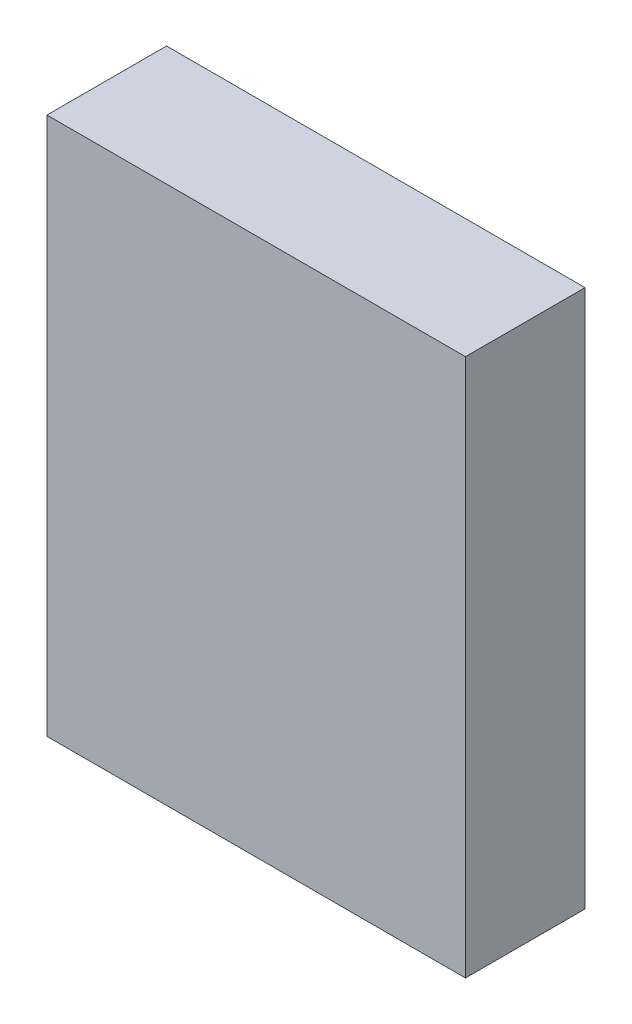
ISO-10303-21;
HEADER;
FILE_DESCRIPTION(('STEP AP214'),'2;1');
FILE_NAME('part.step','',(''),(''),'','','');
FILE_SCHEMA(('AUTOMOTIVE_DESIGN { 1 0 10303 214 1 1 1 1 }'));
ENDSEC;
DATA;
#1=APPLICATION_CONTEXT('core data for automotive mechanical design processes');
#2=APPLICATION_PROTOCOL_DEFINITION('international standard','automotive_design',2000,#1);
#3=PRODUCT_CONTEXT('',#1,'mechanical');
#4=PRODUCT('Part','Part','',(#3));
#5=PRODUCT_RELATED_PRODUCT_CATEGORY('part','',(#4));
#6=PRODUCT_DEFINITION_FORMATION('','',#4);
#7=PRODUCT_DEFINITION_CONTEXT('part definition',#1,'design');
#8=PRODUCT_DEFINITION('design','',#6,#7);
#9=PRODUCT_DEFINITION_SHAPE('','',#8);
#10=(LENGTH_UNIT() NAMED_UNIT(*) SI_UNIT(.MILLI.,.METRE.));
#11=(NAMED_UNIT(*) PLANE_ANGLE_UNIT() SI_UNIT($,.RADIAN.));
#12=(NAMED_UNIT(*) SI_UNIT($,.STERADIAN.) SOLID_ANGLE_UNIT());
#13=UNCERTAINTY_MEASURE_WITH_UNIT(LENGTH_MEASURE(1.E-05),#10,'distance_accuracy_value','');
#14=(GEOMETRIC_REPRESENTATION_CONTEXT(3) GLOBAL_UNCERTAINTY_ASSIGNED_CONTEXT((#13)) GLOBAL_UNIT_ASSIGNED_CONTEXT((#10,
#11,#12)) REPRESENTATION_CONTEXT('',''));
#15=CARTESIAN_POINT('',(0.,0.,0.));
#16=DIRECTION('',(0.,0.,1.));
#17=DIRECTION('',(1.,0.,0.));
#18=AXIS2_PLACEMENT_3D('',#15,#16,#17);
#19=CARTESIAN_POINT('',(35.,-45.,20.));
#20=DIRECTION('',(-1.,0.,0.));
#21=DIRECTION('',(0.,0.,1.));
#22=AXIS2_PLACEMENT_3D('',#19,#20,#21);
#23=PLANE('',#22);
#24=DIRECTION('',(0.,1.,0.));
#25=VECTOR('',#24,1.);
#26=CARTESIAN_POINT('',(35.,-45.,0.));
#27=LINE('',#26,#25);
#28=CARTESIAN_POINT('',(35.,-45.,0.));
#29=VERTEX_POINT('',#28);
#30=CARTESIAN_POINT('',(35.,45.,0.));
#31=VERTEX_POINT('',#30);
#32=EDGE_CURVE('E98',#29,#31,#27,.T.);
#33=ORIENTED_EDGE('',*,*,#32,.T.);
#34=DIRECTION('',(0.,0.,-1.));
#35=VECTOR('',#34,1.);
#36=CARTESIAN_POINT('',(35.,45.,20.));
#37=LINE('',#36,#35);
#38=CARTESIAN_POINT('',(35.,45.,20.));
#39=VERTEX_POINT('',#38);
#40=EDGE_CURVE('E11',#39,#31,#37,.T.);
#41=ORIENTED_EDGE('',*,*,#40,.F.);
#42=DIRECTION('',(0.,1.,0.));
#43=VECTOR('',#42,1.);
#44=CARTESIAN_POINT('',(35.,-45.,20.));
#45=LINE('',#44,#43);
#46=CARTESIAN_POINT('',(35.,-45.,20.));
#47=VERTEX_POINT('',#46);
#48=EDGE_CURVE('E86',#47,#39,#45,.T.);
#49=ORIENTED_EDGE('',*,*,#48,.F.);
#50=DIRECTION('',(0.,0.,-1.));
#51=VECTOR('',#50,1.);
#52=CARTESIAN_POINT('',(35.,-45.,20.));
#53=LINE('',#52,#51);
#54=EDGE_CURVE('E94',#47,#29,#53,.T.);
#55=ORIENTED_EDGE('',*,*,#54,.T.);
#56=EDGE_LOOP('',(#33,#41,#49,#55));
#57=FACE_BOUND('',#56,.T.);
#58=ADVANCED_FACE('F35',(#57),#23,.F.);
#59=CARTESIAN_POINT('',(-35.,45.,20.));
#60=DIRECTION('',(0.,-1.,0.));
#61=DIRECTION('',(0.,0.,-1.));
#62=AXIS2_PLACEMENT_3D('',#59,#60,#61);
#63=PLANE('',#62);
#64=DIRECTION('',(-1.,0.,0.));
#65=VECTOR('',#64,1.);
#66=CARTESIAN_POINT('',(-35.,45.,0.));
#67=LINE('',#66,#65);
#68=CARTESIAN_POINT('',(-35.,45.,0.));
#69=VERTEX_POINT('',#68);
#70=EDGE_CURVE('E90',#31,#69,#67,.T.);
#71=ORIENTED_EDGE('',*,*,#70,.T.);
#72=DIRECTION('',(0.,0.,-1.));
#73=VECTOR('',#72,1.);
#74=CARTESIAN_POINT('',(-35.,45.,20.));
#75=LINE('',#74,#73);
#76=CARTESIAN_POINT('',(-35.,45.,20.));
#77=VERTEX_POINT('',#76);
#78=EDGE_CURVE('E43',#77,#69,#75,.T.);
#79=ORIENTED_EDGE('',*,*,#78,.F.);
#80=DIRECTION('',(-1.,0.,0.));
#81=VECTOR('',#80,1.);
#82=CARTESIAN_POINT('',(-35.,45.,20.));
#83=LINE('',#82,#81);
#84=EDGE_CURVE('E81',#39,#77,#83,.T.);
#85=ORIENTED_EDGE('',*,*,#84,.F.);
#86=ORIENTED_EDGE('',*,*,#40,.T.);
#87=EDGE_LOOP('',(#71,#79,#85,#86));
#88=FACE_BOUND('',#87,.T.);
#89=ADVANCED_FACE('F89',(#88),#63,.F.);
#90=CARTESIAN_POINT('',(-35.,-45.,20.));
#91=DIRECTION('',(1.,0.,0.));
#92=DIRECTION('',(0.,0.,-1.));
#93=AXIS2_PLACEMENT_3D('',#90,#91,#92);
#94=PLANE('',#93);
#95=DIRECTION('',(0.,-1.,0.));
#96=VECTOR('',#95,1.);
#97=CARTESIAN_POINT('',(-35.,-45.,0.));
#98=LINE('',#97,#96);
#99=CARTESIAN_POINT('',(-35.,-45.,0.));
#100=VERTEX_POINT('',#99);
#101=EDGE_CURVE('E68',#69,#100,#98,.T.);
#102=ORIENTED_EDGE('',*,*,#101,.T.);
#103=DIRECTION('',(0.,0.,-1.));
#104=VECTOR('',#103,1.);
#105=CARTESIAN_POINT('',(-35.,-45.,20.));
#106=LINE('',#105,#104);
#107=CARTESIAN_POINT('',(-35.,-45.,20.));
#108=VERTEX_POINT('',#107);
#109=EDGE_CURVE('E91',#108,#100,#106,.T.);
#110=ORIENTED_EDGE('',*,*,#109,.F.);
#111=DIRECTION('',(0.,-1.,0.));
#112=VECTOR('',#111,1.);
#113=CARTESIAN_POINT('',(-35.,-45.,20.));
#114=LINE('',#113,#112);
#115=EDGE_CURVE('E84',#77,#108,#114,.T.);
#116=ORIENTED_EDGE('',*,*,#115,.F.);
#117=ORIENTED_EDGE('',*,*,#78,.T.);
#118=EDGE_LOOP('',(#102,#110,#116,#117));
#119=FACE_BOUND('',#118,.T.);
#120=ADVANCED_FACE('F92',(#119),#94,.F.);
#121=CARTESIAN_POINT('',(-35.,-45.,20.));
#122=DIRECTION('',(0.,1.,0.));
#123=DIRECTION('',(0.,0.,1.));
#124=AXIS2_PLACEMENT_3D('',#121,#122,#123);
#125=PLANE('',#124);
#126=DIRECTION('',(1.,0.,0.));
#127=VECTOR('',#126,1.);
#128=CARTESIAN_POINT('',(-35.,-45.,0.));
#129=LINE('',#128,#127);
#130=EDGE_CURVE('E74',#100,#29,#129,.T.);
#131=ORIENTED_EDGE('',*,*,#130,.T.);
#132=ORIENTED_EDGE('',*,*,#54,.F.);
#133=DIRECTION('',(1.,0.,0.));
#134=VECTOR('',#133,1.);
#135=CARTESIAN_POINT('',(-35.,-45.,20.));
#136=LINE('',#135,#134);
#137=EDGE_CURVE('E51',#108,#47,#136,.T.);
#138=ORIENTED_EDGE('',*,*,#137,.F.);
#139=ORIENTED_EDGE('',*,*,#109,.T.);
#140=EDGE_LOOP('',(#131,#132,#138,#139));
#141=FACE_BOUND('',#140,.T.);
#142=ADVANCED_FACE('F105',(#141),#125,.F.);
#143=CARTESIAN_POINT('',(0.,0.,20.));
#144=DIRECTION('',(0.,0.,-1.));
#145=DIRECTION('',(-1.,0.,0.));
#146=AXIS2_PLACEMENT_3D('',#143,#144,#145);
#147=PLANE('',#146);
#148=ORIENTED_EDGE('',*,*,#48,.T.);
#149=ORIENTED_EDGE('',*,*,#84,.T.);
#150=ORIENTED_EDGE('',*,*,#115,.T.);
#151=ORIENTED_EDGE('',*,*,#137,.T.);
#152=EDGE_LOOP('',(#148,#149,#150,#151));
#153=FACE_BOUND('',#152,.T.);
#154=ADVANCED_FACE('F82',(#153),#147,.F.);
#155=CARTESIAN_POINT('',(0.,0.,0.));
#156=DIRECTION('',(0.,0.,-1.));
#157=DIRECTION('',(-1.,0.,0.));
#158=AXIS2_PLACEMENT_3D('',#155,#156,#157);
#159=PLANE('',#158);
#160=ORIENTED_EDGE('',*,*,#32,.F.);
#161=ORIENTED_EDGE('',*,*,#130,.F.);
#162=ORIENTED_EDGE('',*,*,#101,.F.);
#163=ORIENTED_EDGE('',*,*,#70,.F.);
#164=EDGE_LOOP('',(#160,#161,#162,#163));
#165=FACE_BOUND('',#164,.T.);
#166=ADVANCED_FACE('F108',(#165),#159,.T.);
#167=CLOSED_SHELL('',(#58,#89,#120,#142,#154,#166));
#168=MANIFOLD_SOLID_BREP('B2',#167);
#169=ADVANCED_BREP_SHAPE_REPRESENTATION('',(#18,#168),#14);
#170=SHAPE_DEFINITION_REPRESENTATION(#9,#169);
ENDSEC;
END-ISO-10303-21;
